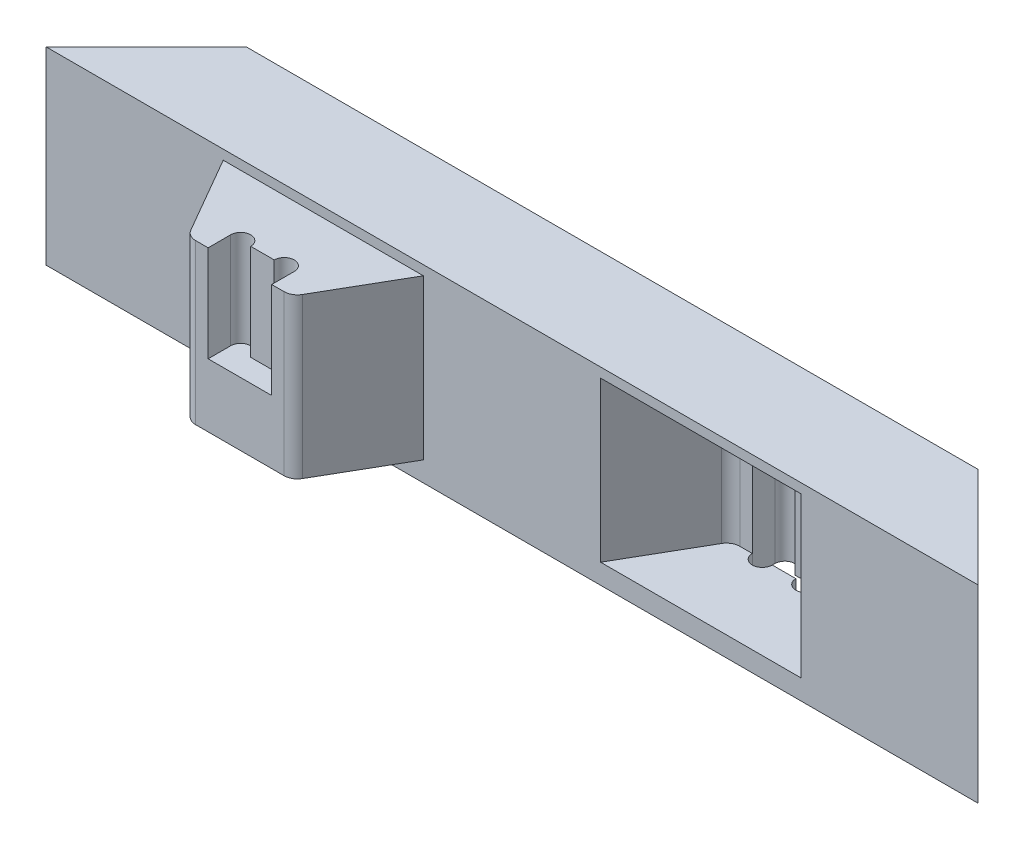
ISO-10303-21;
HEADER;
FILE_DESCRIPTION(('STEP AP214'),'2;1');
FILE_NAME('part.step','',(''),(''),'','','');
FILE_SCHEMA(('AUTOMOTIVE_DESIGN { 1 0 10303 214 1 1 1 1 }'));
ENDSEC;
DATA;
#1=APPLICATION_CONTEXT('core data for automotive mechanical design processes');
#2=APPLICATION_PROTOCOL_DEFINITION('international standard','automotive_design',2000,#1);
#3=PRODUCT_CONTEXT('',#1,'mechanical');
#4=PRODUCT('Part','Part','',(#3));
#5=PRODUCT_RELATED_PRODUCT_CATEGORY('part','',(#4));
#6=PRODUCT_DEFINITION_FORMATION('','',#4);
#7=PRODUCT_DEFINITION_CONTEXT('part definition',#1,'design');
#8=PRODUCT_DEFINITION('design','',#6,#7);
#9=PRODUCT_DEFINITION_SHAPE('','',#8);
#10=(LENGTH_UNIT() NAMED_UNIT(*) SI_UNIT(.MILLI.,.METRE.));
#11=(NAMED_UNIT(*) PLANE_ANGLE_UNIT() SI_UNIT($,.RADIAN.));
#12=(NAMED_UNIT(*) SI_UNIT($,.STERADIAN.) SOLID_ANGLE_UNIT());
#13=UNCERTAINTY_MEASURE_WITH_UNIT(LENGTH_MEASURE(1.E-05),#10,'distance_accuracy_value','');
#14=(GEOMETRIC_REPRESENTATION_CONTEXT(3) GLOBAL_UNCERTAINTY_ASSIGNED_CONTEXT((#13)) GLOBAL_UNIT_ASSIGNED_CONTEXT((#10,
#11,#12)) REPRESENTATION_CONTEXT('',''));
#15=CARTESIAN_POINT('',(0.,0.,0.));
#16=DIRECTION('',(0.,0.,1.));
#17=DIRECTION('',(1.,0.,0.));
#18=AXIS2_PLACEMENT_3D('',#15,#16,#17);
#19=CARTESIAN_POINT('',(-69.85,14.17,10.));
#20=DIRECTION('',(0.,0.,-1.));
#21=DIRECTION('',(-1.,0.,0.));
#22=AXIS2_PLACEMENT_3D('',#19,#20,#21);
#23=PLANE('',#22);
#24=DIRECTION('',(-1.,0.,0.));
#25=VECTOR('',#24,1.);
#26=CARTESIAN_POINT('',(43.2833333333333,12.73,10.));
#27=LINE('',#26,#25);
#28=CARTESIAN_POINT('',(43.2833333333333,12.73,10.));
#29=VERTEX_POINT('',#28);
#30=CARTESIAN_POINT('',(13.2833333333333,12.73,10.));
#31=VERTEX_POINT('',#30);
#32=EDGE_CURVE('E395',#29,#31,#27,.T.);
#33=ORIENTED_EDGE('',*,*,#32,.F.);
#34=DIRECTION('',(0.,-1.,0.));
#35=VECTOR('',#34,1.);
#36=CARTESIAN_POINT('',(43.2833333333333,12.73,10.));
#37=LINE('',#36,#35);
#38=CARTESIAN_POINT('',(43.2833333333333,-11.17,10.));
#39=VERTEX_POINT('',#38);
#40=EDGE_CURVE('E425',#29,#39,#37,.T.);
#41=ORIENTED_EDGE('',*,*,#40,.T.);
#42=DIRECTION('',(-1.,0.,0.));
#43=VECTOR('',#42,1.);
#44=CARTESIAN_POINT('',(43.2833333333333,-11.17,10.));
#45=LINE('',#44,#43);
#46=CARTESIAN_POINT('',(13.2833333333333,-11.17,10.));
#47=VERTEX_POINT('',#46);
#48=EDGE_CURVE('E394',#39,#47,#45,.T.);
#49=ORIENTED_EDGE('',*,*,#48,.T.);
#50=DIRECTION('',(0.,-1.,0.));
#51=VECTOR('',#50,1.);
#52=CARTESIAN_POINT('',(13.2833333333333,12.73,10.));
#53=LINE('',#52,#51);
#54=EDGE_CURVE('E411',#31,#47,#53,.T.);
#55=ORIENTED_EDGE('',*,*,#54,.F.);
#56=EDGE_LOOP('',(#33,#41,#49,#55));
#57=FACE_BOUND('',#56,.T.);
#58=DIRECTION('',(1.,0.,0.));
#59=VECTOR('',#58,1.);
#60=CARTESIAN_POINT('',(-69.85,-14.17,10.));
#61=LINE('',#60,#59);
#62=CARTESIAN_POINT('',(-69.85,-14.17,10.));
#63=VERTEX_POINT('',#62);
#64=CARTESIAN_POINT('',(69.85,-14.17,10.));
#65=VERTEX_POINT('',#64);
#66=EDGE_CURVE('E437',#63,#65,#61,.T.);
#67=ORIENTED_EDGE('',*,*,#66,.T.);
#68=DIRECTION('',(0.,-1.,0.));
#69=VECTOR('',#68,1.);
#70=CARTESIAN_POINT('',(69.85,14.17,10.));
#71=LINE('',#70,#69);
#72=CARTESIAN_POINT('',(69.85,14.17,10.));
#73=VERTEX_POINT('',#72);
#74=EDGE_CURVE('E436',#73,#65,#71,.T.);
#75=ORIENTED_EDGE('',*,*,#74,.F.);
#76=DIRECTION('',(1.,0.,0.));
#77=VECTOR('',#76,1.);
#78=CARTESIAN_POINT('',(-69.85,14.17,10.));
#79=LINE('',#78,#77);
#80=CARTESIAN_POINT('',(-69.85,14.17,10.));
#81=VERTEX_POINT('',#80);
#82=EDGE_CURVE('E433',#81,#73,#79,.T.);
#83=ORIENTED_EDGE('',*,*,#82,.F.);
#84=DIRECTION('',(0.,-1.,0.));
#85=VECTOR('',#84,1.);
#86=CARTESIAN_POINT('',(-69.85,14.17,10.));
#87=LINE('',#86,#85);
#88=EDGE_CURVE('E447',#81,#63,#87,.T.);
#89=ORIENTED_EDGE('',*,*,#88,.T.);
#90=EDGE_LOOP('',(#67,#75,#83,#89));
#91=FACE_BOUND('',#90,.T.);
#92=DIRECTION('',(1.,0.,0.));
#93=VECTOR('',#92,1.);
#94=CARTESIAN_POINT('',(-43.2833333333334,-11.17,10.));
#95=LINE('',#94,#93);
#96=CARTESIAN_POINT('',(-43.2833333333334,-11.17,10.));
#97=VERTEX_POINT('',#96);
#98=CARTESIAN_POINT('',(-13.2833333333334,-11.17,10.));
#99=VERTEX_POINT('',#98);
#100=EDGE_CURVE('E373',#97,#99,#95,.T.);
#101=ORIENTED_EDGE('',*,*,#100,.F.);
#102=DIRECTION('',(0.,-1.,0.));
#103=VECTOR('',#102,1.);
#104=CARTESIAN_POINT('',(-43.2833333333334,45.23,10.));
#105=LINE('',#104,#103);
#106=CARTESIAN_POINT('',(-43.2833333333334,12.73,10.));
#107=VERTEX_POINT('',#106);
#108=EDGE_CURVE('E385',#107,#97,#105,.T.);
#109=ORIENTED_EDGE('',*,*,#108,.F.);
#110=DIRECTION('',(-1.,0.,0.));
#111=VECTOR('',#110,1.);
#112=CARTESIAN_POINT('',(-43.2833333333334,12.73,10.));
#113=LINE('',#112,#111);
#114=CARTESIAN_POINT('',(-13.2833333333334,12.73,10.));
#115=VERTEX_POINT('',#114);
#116=EDGE_CURVE('E370',#115,#107,#113,.T.);
#117=ORIENTED_EDGE('',*,*,#116,.F.);
#118=DIRECTION('',(0.,-1.,0.));
#119=VECTOR('',#118,1.);
#120=CARTESIAN_POINT('',(-13.2833333333334,45.23,10.));
#121=LINE('',#120,#119);
#122=EDGE_CURVE('E363',#115,#99,#121,.T.);
#123=ORIENTED_EDGE('',*,*,#122,.T.);
#124=EDGE_LOOP('',(#101,#109,#117,#123));
#125=FACE_BOUND('',#124,.T.);
#126=ADVANCED_FACE('F38',(#57,#91,#125),#23,.F.);
#127=CARTESIAN_POINT('',(-69.85,14.17,-10.));
#128=DIRECTION('',(0.,0.,1.));
#129=DIRECTION('',(1.,0.,0.));
#130=AXIS2_PLACEMENT_3D('',#127,#128,#129);
#131=PLANE('',#130);
#132=DIRECTION('',(0.,1.,0.));
#133=VECTOR('',#132,1.);
#134=CARTESIAN_POINT('',(-49.8499999999999,14.17,-10.));
#135=LINE('',#134,#133);
#136=CARTESIAN_POINT('',(-49.8499999999999,-14.17,-10.));
#137=VERTEX_POINT('',#136);
#138=CARTESIAN_POINT('',(-49.8499999999999,9.16999999999998,-10.));
#139=VERTEX_POINT('',#138);
#140=EDGE_CURVE('E451',#137,#139,#135,.T.);
#141=ORIENTED_EDGE('',*,*,#140,.T.);
#142=DIRECTION('',(1.,0.,0.));
#143=VECTOR('',#142,1.);
#144=CARTESIAN_POINT('',(-69.85,9.16999999999998,-10.));
#145=LINE('',#144,#143);
#146=CARTESIAN_POINT('',(49.85,9.16999999999998,-10.));
#147=VERTEX_POINT('',#146);
#148=EDGE_CURVE('E478',#139,#147,#145,.T.);
#149=ORIENTED_EDGE('',*,*,#148,.T.);
#150=DIRECTION('',(0.,-1.,0.));
#151=VECTOR('',#150,1.);
#152=CARTESIAN_POINT('',(49.85,14.17,-10.));
#153=LINE('',#152,#151);
#154=CARTESIAN_POINT('',(49.85,-14.17,-10.));
#155=VERTEX_POINT('',#154);
#156=EDGE_CURVE('E455',#147,#155,#153,.T.);
#157=ORIENTED_EDGE('',*,*,#156,.T.);
#158=DIRECTION('',(-1.,0.,0.));
#159=VECTOR('',#158,1.);
#160=CARTESIAN_POINT('',(-69.85,-14.17,-10.));
#161=LINE('',#160,#159);
#162=EDGE_CURVE('E429',#155,#137,#161,.T.);
#163=ORIENTED_EDGE('',*,*,#162,.T.);
#164=EDGE_LOOP('',(#141,#149,#157,#163));
#165=FACE_BOUND('',#164,.T.);
#166=ADVANCED_FACE('F683',(#165),#131,.F.);
#167=CARTESIAN_POINT('',(0.,14.17,0.));
#168=DIRECTION('',(0.,-1.,0.));
#169=DIRECTION('',(0.,0.,-1.));
#170=AXIS2_PLACEMENT_3D('',#167,#168,#169);
#171=PLANE('',#170);
#172=DIRECTION('',(0.707106781186548,0.,0.707106781186547));
#173=VECTOR('',#172,1.);
#174=CARTESIAN_POINT('',(49.85,14.17,-10.));
#175=LINE('',#174,#173);
#176=CARTESIAN_POINT('',(54.85,14.17,-4.99999999999999));
#177=VERTEX_POINT('',#176);
#178=EDGE_CURVE('E467',#73,#177,#175,.F.);
#179=ORIENTED_EDGE('',*,*,#178,.T.);
#180=DIRECTION('',(-1.,0.,0.));
#181=VECTOR('',#180,1.);
#182=CARTESIAN_POINT('',(0.,14.17,-4.99999999999999));
#183=LINE('',#182,#181);
#184=CARTESIAN_POINT('',(-54.85,14.17,-5.));
#185=VERTEX_POINT('',#184);
#186=EDGE_CURVE('E471',#177,#185,#183,.T.);
#187=ORIENTED_EDGE('',*,*,#186,.T.);
#188=DIRECTION('',(0.707106781186549,0.,-0.707106781186546));
#189=VECTOR('',#188,1.);
#190=CARTESIAN_POINT('',(-69.85,14.17,10.));
#191=LINE('',#190,#189);
#192=EDGE_CURVE('E464',#185,#81,#191,.F.);
#193=ORIENTED_EDGE('',*,*,#192,.T.);
#194=ORIENTED_EDGE('',*,*,#82,.T.);
#195=EDGE_LOOP('',(#179,#187,#193,#194));
#196=FACE_BOUND('',#195,.T.);
#197=ADVANCED_FACE('F689',(#196),#171,.F.);
#198=CARTESIAN_POINT('',(0.,-14.17,0.));
#199=DIRECTION('',(0.,-1.,0.));
#200=DIRECTION('',(0.,0.,-1.));
#201=AXIS2_PLACEMENT_3D('',#198,#199,#200);
#202=PLANE('',#201);
#203=CARTESIAN_POINT('',(25.0183333333333,-14.17,-2.5));
#204=DIRECTION('',(0.,-1.,0.));
#205=DIRECTION('',(0.,0.,1.));
#206=AXIS2_PLACEMENT_3D('',#203,#204,#205);
#207=CIRCLE('',#206,1.5);
#208=CARTESIAN_POINT('',(26.5183333333333,-14.17,-2.5));
#209=VERTEX_POINT('',#208);
#210=CARTESIAN_POINT('',(23.5183333333333,-14.17,-2.5));
#211=VERTEX_POINT('',#210);
#212=EDGE_CURVE('E625',#209,#211,#207,.T.);
#213=ORIENTED_EDGE('',*,*,#212,.F.);
#214=DIRECTION('',(-1.,0.,0.));
#215=VECTOR('',#214,1.);
#216=CARTESIAN_POINT('',(26.5183333333333,-14.17,-2.5));
#217=LINE('',#216,#215);
#218=CARTESIAN_POINT('',(30.0483333333333,-14.17,-2.5));
#219=VERTEX_POINT('',#218);
#220=EDGE_CURVE('E277',#219,#209,#217,.T.);
#221=ORIENTED_EDGE('',*,*,#220,.F.);
#222=CARTESIAN_POINT('',(31.5483333333333,-14.17,-2.5));
#223=DIRECTION('',(0.,-1.,0.));
#224=DIRECTION('',(0.,0.,-1.));
#225=AXIS2_PLACEMENT_3D('',#222,#223,#224);
#226=CIRCLE('',#225,1.5);
#227=CARTESIAN_POINT('',(33.0483333333333,-14.17,-2.5));
#228=VERTEX_POINT('',#227);
#229=EDGE_CURVE('E604',#228,#219,#226,.T.);
#230=ORIENTED_EDGE('',*,*,#229,.F.);
#231=DIRECTION('',(0.,0.,1.));
#232=VECTOR('',#231,1.);
#233=CARTESIAN_POINT('',(33.0483333333333,-14.17,-2.5));
#234=LINE('',#233,#232);
#235=CARTESIAN_POINT('',(33.0483333333333,-14.17,-5.88));
#236=VERTEX_POINT('',#235);
#237=EDGE_CURVE('E608',#236,#228,#234,.T.);
#238=ORIENTED_EDGE('',*,*,#237,.F.);
#239=CARTESIAN_POINT('',(31.5483333333333,-14.17,-5.88));
#240=DIRECTION('',(0.,-1.,0.));
#241=DIRECTION('',(0.,0.,1.));
#242=AXIS2_PLACEMENT_3D('',#239,#240,#241);
#243=CIRCLE('',#242,1.5);
#244=CARTESIAN_POINT('',(30.0483333333333,-14.17,-5.88));
#245=VERTEX_POINT('',#244);
#246=EDGE_CURVE('E612',#245,#236,#243,.T.);
#247=ORIENTED_EDGE('',*,*,#246,.F.);
#248=DIRECTION('',(1.,0.,0.));
#249=VECTOR('',#248,1.);
#250=CARTESIAN_POINT('',(26.5183333333333,-14.17,-5.88));
#251=LINE('',#250,#249);
#252=CARTESIAN_POINT('',(26.5183333333333,-14.17,-5.88));
#253=VERTEX_POINT('',#252);
#254=EDGE_CURVE('E616',#253,#245,#251,.T.);
#255=ORIENTED_EDGE('',*,*,#254,.F.);
#256=CARTESIAN_POINT('',(25.0183333333333,-14.17,-5.88));
#257=DIRECTION('',(0.,-1.,0.));
#258=DIRECTION('',(0.,0.,-1.));
#259=AXIS2_PLACEMENT_3D('',#256,#257,#258);
#260=CIRCLE('',#259,1.5);
#261=CARTESIAN_POINT('',(23.5183333333333,-14.17,-5.88));
#262=VERTEX_POINT('',#261);
#263=EDGE_CURVE('E619',#262,#253,#260,.T.);
#264=ORIENTED_EDGE('',*,*,#263,.F.);
#265=DIRECTION('',(0.,0.,-1.));
#266=VECTOR('',#265,1.);
#267=CARTESIAN_POINT('',(23.5183333333333,-14.17,-2.5));
#268=LINE('',#267,#266);
#269=EDGE_CURVE('E622',#211,#262,#268,.T.);
#270=ORIENTED_EDGE('',*,*,#269,.F.);
#271=EDGE_LOOP('',(#213,#221,#230,#238,#247,#255,#264,#270));
#272=FACE_BOUND('',#271,.T.);
#273=ORIENTED_EDGE('',*,*,#162,.F.);
#274=DIRECTION('',(-0.707106781186548,0.,-0.707106781186547));
#275=VECTOR('',#274,1.);
#276=CARTESIAN_POINT('',(29.925,-14.17,-29.925));
#277=LINE('',#276,#275);
#278=EDGE_CURVE('E461',#155,#65,#277,.F.);
#279=ORIENTED_EDGE('',*,*,#278,.T.);
#280=ORIENTED_EDGE('',*,*,#66,.F.);
#281=DIRECTION('',(-0.707106781186549,0.,0.707106781186546));
#282=VECTOR('',#281,1.);
#283=CARTESIAN_POINT('',(-29.9249999999999,-14.17,-29.925));
#284=LINE('',#283,#282);
#285=EDGE_CURVE('E458',#63,#137,#284,.F.);
#286=ORIENTED_EDGE('',*,*,#285,.T.);
#287=EDGE_LOOP('',(#273,#279,#280,#286));
#288=FACE_BOUND('',#287,.T.);
#289=ADVANCED_FACE('F668',(#272,#288),#202,.T.);
#290=CARTESIAN_POINT('',(36.0664549684629,12.73,-2.5));
#291=DIRECTION('',(0.866025403784436,0.,-0.500000000000004));
#292=DIRECTION('',(-0.500000000000004,0.,-0.866025403784436));
#293=AXIS2_PLACEMENT_3D('',#290,#291,#292);
#294=PLANE('',#293);
#295=DIRECTION('',(0.500000000000004,0.,0.866025403784436));
#296=VECTOR('',#295,1.);
#297=CARTESIAN_POINT('',(36.0664549684629,12.73,-2.5));
#298=LINE('',#297,#296);
#299=CARTESIAN_POINT('',(36.6438052376525,12.73,-1.50000000000001));
#300=VERTEX_POINT('',#299);
#301=EDGE_CURVE('E408',#300,#29,#298,.T.);
#302=ORIENTED_EDGE('',*,*,#301,.F.);
#303=DIRECTION('',(0.,-1.,0.));
#304=VECTOR('',#303,1.);
#305=CARTESIAN_POINT('',(36.6438052376525,-11.17,-1.50000000000001));
#306=LINE('',#305,#304);
#307=CARTESIAN_POINT('',(36.6438052376525,-11.17,-1.50000000000001));
#308=VERTEX_POINT('',#307);
#309=EDGE_CURVE('E263',#300,#308,#306,.T.);
#310=ORIENTED_EDGE('',*,*,#309,.T.);
#311=DIRECTION('',(0.500000000000004,0.,0.866025403784436));
#312=VECTOR('',#311,1.);
#313=CARTESIAN_POINT('',(36.0664549684629,-11.17,-2.5));
#314=LINE('',#313,#312);
#315=EDGE_CURVE('E400',#308,#39,#314,.T.);
#316=ORIENTED_EDGE('',*,*,#315,.T.);
#317=ORIENTED_EDGE('',*,*,#40,.F.);
#318=EDGE_LOOP('',(#302,#310,#316,#317));
#319=FACE_BOUND('',#318,.T.);
#320=ADVANCED_FACE('F819',(#319),#294,.F.);
#321=CARTESIAN_POINT('',(20.5002116982037,12.73,-2.5));
#322=DIRECTION('',(0.,0.,-1.));
#323=DIRECTION('',(-1.,0.,0.));
#324=AXIS2_PLACEMENT_3D('',#321,#322,#323);
#325=PLANE('',#324);
#326=DIRECTION('',(1.,0.,0.));
#327=VECTOR('',#326,1.);
#328=CARTESIAN_POINT('',(20.5002116982037,-11.17,-2.5));
#329=LINE('',#328,#327);
#330=CARTESIAN_POINT('',(33.0483333333333,-11.17,-2.5));
#331=VERTEX_POINT('',#330);
#332=CARTESIAN_POINT('',(34.9117544300837,-11.17,-2.5));
#333=VERTEX_POINT('',#332);
#334=EDGE_CURVE('E419',#331,#333,#329,.T.);
#335=ORIENTED_EDGE('',*,*,#334,.T.);
#336=DIRECTION('',(0.,-1.,0.));
#337=VECTOR('',#336,1.);
#338=CARTESIAN_POINT('',(34.9117544300837,12.73,-2.5));
#339=LINE('',#338,#337);
#340=CARTESIAN_POINT('',(34.9117544300837,12.73,-2.5));
#341=VERTEX_POINT('',#340);
#342=EDGE_CURVE('E502',#333,#341,#339,.F.);
#343=ORIENTED_EDGE('',*,*,#342,.T.);
#344=DIRECTION('',(1.,0.,0.));
#345=VECTOR('',#344,1.);
#346=CARTESIAN_POINT('',(20.5002116982037,12.73,-2.5));
#347=LINE('',#346,#345);
#348=CARTESIAN_POINT('',(21.654912236583,12.73,-2.5));
#349=VERTEX_POINT('',#348);
#350=EDGE_CURVE('E404',#349,#341,#347,.T.);
#351=ORIENTED_EDGE('',*,*,#350,.F.);
#352=DIRECTION('',(0.,-1.,0.));
#353=VECTOR('',#352,1.);
#354=CARTESIAN_POINT('',(21.654912236583,-11.17,-2.5));
#355=LINE('',#354,#353);
#356=CARTESIAN_POINT('',(21.654912236583,-11.17,-2.5));
#357=VERTEX_POINT('',#356);
#358=EDGE_CURVE('E499',#349,#357,#355,.T.);
#359=ORIENTED_EDGE('',*,*,#358,.T.);
#360=CARTESIAN_POINT('',(23.5183333333333,-11.17,-2.5));
#361=VERTEX_POINT('',#360);
#362=EDGE_CURVE('E283',#357,#361,#329,.T.);
#363=ORIENTED_EDGE('',*,*,#362,.T.);
#364=DIRECTION('',(0.,-1.,0.));
#365=VECTOR('',#364,1.);
#366=CARTESIAN_POINT('',(23.5183333333333,4.85,-2.5));
#367=LINE('',#366,#365);
#368=CARTESIAN_POINT('',(23.5183333333333,4.85,-2.5));
#369=VERTEX_POINT('',#368);
#370=EDGE_CURVE('E271',#369,#361,#367,.T.);
#371=ORIENTED_EDGE('',*,*,#370,.F.);
#372=DIRECTION('',(1.,0.,0.));
#373=VECTOR('',#372,1.);
#374=CARTESIAN_POINT('',(20.5002116982037,4.85,-2.5));
#375=LINE('',#374,#373);
#376=CARTESIAN_POINT('',(33.0483333333333,4.85,-2.5));
#377=VERTEX_POINT('',#376);
#378=EDGE_CURVE('E251',#369,#377,#375,.T.);
#379=ORIENTED_EDGE('',*,*,#378,.T.);
#380=DIRECTION('',(0.,-1.,0.));
#381=VECTOR('',#380,1.);
#382=CARTESIAN_POINT('',(33.0483333333333,4.85,-2.5));
#383=LINE('',#382,#381);
#384=EDGE_CURVE('E584',#377,#331,#383,.T.);
#385=ORIENTED_EDGE('',*,*,#384,.T.);
#386=EDGE_LOOP('',(#335,#343,#351,#359,#363,#371,#379,#385));
#387=FACE_BOUND('',#386,.T.);
#388=ADVANCED_FACE('F280',(#387),#325,.F.);
#389=CARTESIAN_POINT('',(13.2833333333333,12.73,10.));
#390=DIRECTION('',(-0.866025403784436,0.,-0.500000000000004));
#391=DIRECTION('',(-0.500000000000004,0.,0.866025403784436));
#392=AXIS2_PLACEMENT_3D('',#389,#390,#391);
#393=PLANE('',#392);
#394=DIRECTION('',(0.500000000000004,0.,-0.866025403784436));
#395=VECTOR('',#394,1.);
#396=CARTESIAN_POINT('',(13.2833333333333,-11.17,10.));
#397=LINE('',#396,#395);
#398=CARTESIAN_POINT('',(19.9228614290141,-11.17,-1.50000000000001));
#399=VERTEX_POINT('',#398);
#400=EDGE_CURVE('E415',#47,#399,#397,.T.);
#401=ORIENTED_EDGE('',*,*,#400,.T.);
#402=DIRECTION('',(0.,-1.,0.));
#403=VECTOR('',#402,1.);
#404=CARTESIAN_POINT('',(19.9228614290141,12.73,-1.50000000000001));
#405=LINE('',#404,#403);
#406=CARTESIAN_POINT('',(19.9228614290141,12.73,-1.50000000000001));
#407=VERTEX_POINT('',#406);
#408=EDGE_CURVE('E511',#399,#407,#405,.F.);
#409=ORIENTED_EDGE('',*,*,#408,.T.);
#410=DIRECTION('',(0.500000000000004,0.,-0.866025403784436));
#411=VECTOR('',#410,1.);
#412=CARTESIAN_POINT('',(13.2833333333333,12.73,10.));
#413=LINE('',#412,#411);
#414=EDGE_CURVE('E399',#31,#407,#413,.T.);
#415=ORIENTED_EDGE('',*,*,#414,.F.);
#416=ORIENTED_EDGE('',*,*,#54,.T.);
#417=EDGE_LOOP('',(#401,#409,#415,#416));
#418=FACE_BOUND('',#417,.T.);
#419=ADVANCED_FACE('F800',(#418),#393,.F.);
#420=CARTESIAN_POINT('',(0.,12.73,0.));
#421=DIRECTION('',(0.,-1.,0.));
#422=DIRECTION('',(0.,0.,-1.));
#423=AXIS2_PLACEMENT_3D('',#420,#421,#422);
#424=PLANE('',#423);
#425=ORIENTED_EDGE('',*,*,#350,.T.);
#426=CARTESIAN_POINT('',(34.9117544300837,12.73,-0.499999999999999));
#427=DIRECTION('',(0.,-1.,0.));
#428=DIRECTION('',(0.,0.,-1.));
#429=AXIS2_PLACEMENT_3D('',#426,#427,#428);
#430=CIRCLE('',#429,2.);
#431=EDGE_CURVE('E508',#341,#300,#430,.T.);
#432=ORIENTED_EDGE('',*,*,#431,.T.);
#433=ORIENTED_EDGE('',*,*,#301,.T.);
#434=ORIENTED_EDGE('',*,*,#32,.T.);
#435=ORIENTED_EDGE('',*,*,#414,.T.);
#436=CARTESIAN_POINT('',(21.654912236583,12.73,-0.499999999999999));
#437=DIRECTION('',(0.,-1.,0.));
#438=DIRECTION('',(0.,0.,-1.));
#439=AXIS2_PLACEMENT_3D('',#436,#437,#438);
#440=CIRCLE('',#439,2.);
#441=EDGE_CURVE('E505',#407,#349,#440,.T.);
#442=ORIENTED_EDGE('',*,*,#441,.T.);
#443=EDGE_LOOP('',(#425,#432,#433,#434,#435,#442));
#444=FACE_BOUND('',#443,.T.);
#445=ADVANCED_FACE('F791',(#444),#424,.T.);
#446=CARTESIAN_POINT('',(0.,-11.17,0.));
#447=DIRECTION('',(0.,-1.,0.));
#448=DIRECTION('',(0.,0.,-1.));
#449=AXIS2_PLACEMENT_3D('',#446,#447,#448);
#450=PLANE('',#449);
#451=ORIENTED_EDGE('',*,*,#315,.F.);
#452=CARTESIAN_POINT('',(34.9117544300837,-11.17,-0.499999999999999));
#453=DIRECTION('',(0.,-1.,0.));
#454=DIRECTION('',(0.,0.,-1.));
#455=AXIS2_PLACEMENT_3D('',#452,#453,#454);
#456=CIRCLE('',#455,2.);
#457=EDGE_CURVE('E496',#308,#333,#456,.F.);
#458=ORIENTED_EDGE('',*,*,#457,.T.);
#459=ORIENTED_EDGE('',*,*,#334,.F.);
#460=CARTESIAN_POINT('',(31.5483333333333,-11.17,-2.5));
#461=DIRECTION('',(0.,-1.,0.));
#462=DIRECTION('',(0.,0.,-1.));
#463=AXIS2_PLACEMENT_3D('',#460,#461,#462);
#464=CIRCLE('',#463,1.5);
#465=CARTESIAN_POINT('',(30.0483333333333,-11.17,-2.5));
#466=VERTEX_POINT('',#465);
#467=EDGE_CURVE('E484',#331,#466,#464,.T.);
#468=ORIENTED_EDGE('',*,*,#467,.T.);
#469=CARTESIAN_POINT('',(26.5183333333333,-11.17,-2.5));
#470=VERTEX_POINT('',#469);
#471=EDGE_CURVE('E422',#470,#466,#329,.T.);
#472=ORIENTED_EDGE('',*,*,#471,.F.);
#473=CARTESIAN_POINT('',(25.0183333333333,-11.17,-2.5));
#474=DIRECTION('',(0.,-1.,0.));
#475=DIRECTION('',(0.,0.,-1.));
#476=AXIS2_PLACEMENT_3D('',#473,#474,#475);
#477=CIRCLE('',#476,1.5);
#478=EDGE_CURVE('E264',#470,#361,#477,.T.);
#479=ORIENTED_EDGE('',*,*,#478,.T.);
#480=ORIENTED_EDGE('',*,*,#362,.F.);
#481=CARTESIAN_POINT('',(21.654912236583,-11.17,-0.499999999999999));
#482=DIRECTION('',(0.,-1.,0.));
#483=DIRECTION('',(0.,0.,-1.));
#484=AXIS2_PLACEMENT_3D('',#481,#482,#483);
#485=CIRCLE('',#484,2.);
#486=EDGE_CURVE('E493',#357,#399,#485,.F.);
#487=ORIENTED_EDGE('',*,*,#486,.T.);
#488=ORIENTED_EDGE('',*,*,#400,.F.);
#489=ORIENTED_EDGE('',*,*,#48,.F.);
#490=EDGE_LOOP('',(#451,#458,#459,#468,#472,#479,#480,#487,#488,#489));
#491=FACE_BOUND('',#490,.T.);
#492=ADVANCED_FACE('F655',(#491),#450,.F.);
#493=CARTESIAN_POINT('',(-43.2833333333334,45.23,10.));
#494=DIRECTION('',(-0.866025403784436,0.,0.500000000000005));
#495=DIRECTION('',(0.500000000000005,0.,0.866025403784436));
#496=AXIS2_PLACEMENT_3D('',#493,#494,#495);
#497=PLANE('',#496);
#498=DIRECTION('',(-0.500000000000005,0.,-0.866025403784436));
#499=VECTOR('',#498,1.);
#500=CARTESIAN_POINT('',(-43.2833333333334,-11.17,10.));
#501=LINE('',#500,#499);
#502=CARTESIAN_POINT('',(-36.6438052376526,-11.17,21.5));
#503=VERTEX_POINT('',#502);
#504=EDGE_CURVE('E342',#503,#97,#501,.T.);
#505=ORIENTED_EDGE('',*,*,#504,.F.);
#506=DIRECTION('',(0.,-1.,0.));
#507=VECTOR('',#506,1.);
#508=CARTESIAN_POINT('',(-36.6438052376526,45.23,21.5));
#509=LINE('',#508,#507);
#510=CARTESIAN_POINT('',(-36.6438052376526,12.73,21.5));
#511=VERTEX_POINT('',#510);
#512=EDGE_CURVE('E11',#503,#511,#509,.F.);
#513=ORIENTED_EDGE('',*,*,#512,.T.);
#514=DIRECTION('',(0.500000000000005,0.,0.866025403784436));
#515=VECTOR('',#514,1.);
#516=CARTESIAN_POINT('',(-43.2833333333334,12.73,10.));
#517=LINE('',#516,#515);
#518=EDGE_CURVE('E367',#107,#511,#517,.T.);
#519=ORIENTED_EDGE('',*,*,#518,.F.);
#520=ORIENTED_EDGE('',*,*,#108,.T.);
#521=EDGE_LOOP('',(#505,#513,#519,#520));
#522=FACE_BOUND('',#521,.T.);
#523=ADVANCED_FACE('F554',(#522),#497,.T.);
#524=CARTESIAN_POINT('',(-36.066454968463,45.23,22.5));
#525=DIRECTION('',(0.,0.,1.));
#526=DIRECTION('',(1.,0.,0.));
#527=AXIS2_PLACEMENT_3D('',#524,#525,#526);
#528=PLANE('',#527);
#529=DIRECTION('',(-1.,0.,0.));
#530=VECTOR('',#529,1.);
#531=CARTESIAN_POINT('',(-36.066454968463,-11.17,22.5));
#532=LINE('',#531,#530);
#533=CARTESIAN_POINT('',(-21.654912236583,-11.17,22.5));
#534=VERTEX_POINT('',#533);
#535=CARTESIAN_POINT('',(-34.9117544300837,-11.17,22.5));
#536=VERTEX_POINT('',#535);
#537=EDGE_CURVE('E381',#534,#536,#532,.T.);
#538=ORIENTED_EDGE('',*,*,#537,.F.);
#539=DIRECTION('',(0.,-1.,0.));
#540=VECTOR('',#539,1.);
#541=CARTESIAN_POINT('',(-21.654912236583,45.23,22.5));
#542=LINE('',#541,#540);
#543=CARTESIAN_POINT('',(-21.654912236583,12.73,22.5));
#544=VERTEX_POINT('',#543);
#545=EDGE_CURVE('E60',#534,#544,#542,.F.);
#546=ORIENTED_EDGE('',*,*,#545,.T.);
#547=DIRECTION('',(1.,0.,0.));
#548=VECTOR('',#547,1.);
#549=CARTESIAN_POINT('',(-36.066454968463,12.73,22.5));
#550=LINE('',#549,#548);
#551=CARTESIAN_POINT('',(-23.5183333333334,12.73,22.5));
#552=VERTEX_POINT('',#551);
#553=EDGE_CURVE('E362',#552,#544,#550,.T.);
#554=ORIENTED_EDGE('',*,*,#553,.F.);
#555=DIRECTION('',(0.,1.,0.));
#556=VECTOR('',#555,1.);
#557=CARTESIAN_POINT('',(-23.5183333333334,-1.68,22.5));
#558=LINE('',#557,#556);
#559=CARTESIAN_POINT('',(-23.5183333333334,-1.68,22.5));
#560=VERTEX_POINT('',#559);
#561=EDGE_CURVE('E349',#560,#552,#558,.T.);
#562=ORIENTED_EDGE('',*,*,#561,.F.);
#563=DIRECTION('',(1.,0.,0.));
#564=VECTOR('',#563,1.);
#565=CARTESIAN_POINT('',(-33.0483333333334,-1.68,22.5));
#566=LINE('',#565,#564);
#567=CARTESIAN_POINT('',(-33.0483333333334,-1.68,22.5));
#568=VERTEX_POINT('',#567);
#569=EDGE_CURVE('E303',#568,#560,#566,.T.);
#570=ORIENTED_EDGE('',*,*,#569,.F.);
#571=DIRECTION('',(0.,1.,0.));
#572=VECTOR('',#571,1.);
#573=CARTESIAN_POINT('',(-33.0483333333334,-1.68,22.5));
#574=LINE('',#573,#572);
#575=CARTESIAN_POINT('',(-33.0483333333334,12.73,22.5));
#576=VERTEX_POINT('',#575);
#577=EDGE_CURVE('E352',#568,#576,#574,.T.);
#578=ORIENTED_EDGE('',*,*,#577,.T.);
#579=CARTESIAN_POINT('',(-34.9117544300837,12.73,22.5));
#580=VERTEX_POINT('',#579);
#581=EDGE_CURVE('E364',#580,#576,#550,.T.);
#582=ORIENTED_EDGE('',*,*,#581,.F.);
#583=DIRECTION('',(0.,-1.,0.));
#584=VECTOR('',#583,1.);
#585=CARTESIAN_POINT('',(-34.9117544300837,45.23,22.5));
#586=LINE('',#585,#584);
#587=EDGE_CURVE('E524',#580,#536,#586,.T.);
#588=ORIENTED_EDGE('',*,*,#587,.T.);
#589=EDGE_LOOP('',(#538,#546,#554,#562,#570,#578,#582,#588));
#590=FACE_BOUND('',#589,.T.);
#591=ADVANCED_FACE('F548',(#590),#528,.T.);
#592=CARTESIAN_POINT('',(-20.5002116982038,45.23,22.5));
#593=DIRECTION('',(0.866025403784436,0.,0.500000000000004));
#594=DIRECTION('',(0.500000000000004,0.,-0.866025403784436));
#595=AXIS2_PLACEMENT_3D('',#592,#593,#594);
#596=PLANE('',#595);
#597=DIRECTION('',(0.500000000000004,0.,-0.866025403784436));
#598=VECTOR('',#597,1.);
#599=CARTESIAN_POINT('',(-20.5002116982038,12.73,22.5));
#600=LINE('',#599,#598);
#601=CARTESIAN_POINT('',(-19.9228614290141,12.73,21.5));
#602=VERTEX_POINT('',#601);
#603=EDGE_CURVE('E359',#602,#115,#600,.T.);
#604=ORIENTED_EDGE('',*,*,#603,.F.);
#605=DIRECTION('',(0.,-1.,0.));
#606=VECTOR('',#605,1.);
#607=CARTESIAN_POINT('',(-19.9228614290141,45.23,21.5));
#608=LINE('',#607,#606);
#609=CARTESIAN_POINT('',(-19.9228614290141,-11.17,21.5));
#610=VERTEX_POINT('',#609);
#611=EDGE_CURVE('E514',#602,#610,#608,.T.);
#612=ORIENTED_EDGE('',*,*,#611,.T.);
#613=DIRECTION('',(-0.500000000000004,0.,0.866025403784436));
#614=VECTOR('',#613,1.);
#615=CARTESIAN_POINT('',(-20.5002116982038,-11.17,22.5));
#616=LINE('',#615,#614);
#617=EDGE_CURVE('E377',#99,#610,#616,.T.);
#618=ORIENTED_EDGE('',*,*,#617,.F.);
#619=ORIENTED_EDGE('',*,*,#122,.F.);
#620=EDGE_LOOP('',(#604,#612,#618,#619));
#621=FACE_BOUND('',#620,.T.);
#622=ADVANCED_FACE('F543',(#621),#596,.T.);
#623=CARTESIAN_POINT('',(0.,-11.17,0.));
#624=DIRECTION('',(0.,1.,0.));
#625=DIRECTION('',(0.,0.,1.));
#626=AXIS2_PLACEMENT_3D('',#623,#624,#625);
#627=PLANE('',#626);
#628=ORIENTED_EDGE('',*,*,#617,.T.);
#629=CARTESIAN_POINT('',(-21.654912236583,-11.17,20.5));
#630=DIRECTION('',(0.,1.,0.));
#631=DIRECTION('',(0.,0.,1.));
#632=AXIS2_PLACEMENT_3D('',#629,#630,#631);
#633=CIRCLE('',#632,2.);
#634=EDGE_CURVE('E521',#610,#534,#633,.F.);
#635=ORIENTED_EDGE('',*,*,#634,.T.);
#636=ORIENTED_EDGE('',*,*,#537,.T.);
#637=CARTESIAN_POINT('',(-34.9117544300837,-11.17,20.5));
#638=DIRECTION('',(0.,1.,0.));
#639=DIRECTION('',(0.,0.,1.));
#640=AXIS2_PLACEMENT_3D('',#637,#638,#639);
#641=CIRCLE('',#640,2.);
#642=EDGE_CURVE('E518',#536,#503,#641,.F.);
#643=ORIENTED_EDGE('',*,*,#642,.T.);
#644=ORIENTED_EDGE('',*,*,#504,.T.);
#645=ORIENTED_EDGE('',*,*,#100,.T.);
#646=EDGE_LOOP('',(#628,#635,#636,#643,#644,#645));
#647=FACE_BOUND('',#646,.T.);
#648=ADVANCED_FACE('F547',(#647),#627,.F.);
#649=CARTESIAN_POINT('',(0.,12.73,0.));
#650=DIRECTION('',(0.,-1.,0.));
#651=DIRECTION('',(0.,0.,-1.));
#652=AXIS2_PLACEMENT_3D('',#649,#650,#651);
#653=PLANE('',#652);
#654=ORIENTED_EDGE('',*,*,#553,.T.);
#655=CARTESIAN_POINT('',(-21.654912236583,12.73,20.5));
#656=DIRECTION('',(0.,-1.,0.));
#657=DIRECTION('',(0.,0.,-1.));
#658=AXIS2_PLACEMENT_3D('',#655,#656,#657);
#659=CIRCLE('',#658,2.);
#660=EDGE_CURVE('E47',#544,#602,#659,.F.);
#661=ORIENTED_EDGE('',*,*,#660,.T.);
#662=ORIENTED_EDGE('',*,*,#603,.T.);
#663=ORIENTED_EDGE('',*,*,#116,.T.);
#664=ORIENTED_EDGE('',*,*,#518,.T.);
#665=CARTESIAN_POINT('',(-34.9117544300837,12.73,20.5));
#666=DIRECTION('',(0.,-1.,0.));
#667=DIRECTION('',(0.,0.,-1.));
#668=AXIS2_PLACEMENT_3D('',#665,#666,#667);
#669=CIRCLE('',#668,2.);
#670=EDGE_CURVE('E530',#511,#580,#669,.F.);
#671=ORIENTED_EDGE('',*,*,#670,.T.);
#672=ORIENTED_EDGE('',*,*,#581,.T.);
#673=DIRECTION('',(0.,0.,1.));
#674=VECTOR('',#673,1.);
#675=CARTESIAN_POINT('',(-33.0483333333334,12.73,19.12));
#676=LINE('',#675,#674);
#677=CARTESIAN_POINT('',(-33.0483333333334,12.73,19.12));
#678=VERTEX_POINT('',#677);
#679=EDGE_CURVE('E323',#678,#576,#676,.T.);
#680=ORIENTED_EDGE('',*,*,#679,.F.);
#681=CARTESIAN_POINT('',(-31.5483333333334,12.73,19.12));
#682=DIRECTION('',(0.,1.,0.));
#683=DIRECTION('',(0.,0.,-1.));
#684=AXIS2_PLACEMENT_3D('',#681,#682,#683);
#685=CIRCLE('',#684,1.5);
#686=CARTESIAN_POINT('',(-30.0483333333334,12.73,19.12));
#687=VERTEX_POINT('',#686);
#688=EDGE_CURVE('E320',#687,#678,#685,.T.);
#689=ORIENTED_EDGE('',*,*,#688,.F.);
#690=DIRECTION('',(-1.,0.,0.));
#691=VECTOR('',#690,1.);
#692=CARTESIAN_POINT('',(-30.0483333333334,12.73,19.12));
#693=LINE('',#692,#691);
#694=CARTESIAN_POINT('',(-26.5183333333334,12.73,19.12));
#695=VERTEX_POINT('',#694);
#696=EDGE_CURVE('E299',#695,#687,#693,.T.);
#697=ORIENTED_EDGE('',*,*,#696,.F.);
#698=CARTESIAN_POINT('',(-25.0183333333334,12.73,19.12));
#699=DIRECTION('',(0.,1.,0.));
#700=DIRECTION('',(0.,0.,1.));
#701=AXIS2_PLACEMENT_3D('',#698,#699,#700);
#702=CIRCLE('',#701,1.5);
#703=CARTESIAN_POINT('',(-23.5183333333334,12.73,19.12));
#704=VERTEX_POINT('',#703);
#705=EDGE_CURVE('E332',#704,#695,#702,.T.);
#706=ORIENTED_EDGE('',*,*,#705,.F.);
#707=DIRECTION('',(0.,0.,-1.));
#708=VECTOR('',#707,1.);
#709=CARTESIAN_POINT('',(-23.5183333333334,12.73,22.5));
#710=LINE('',#709,#708);
#711=EDGE_CURVE('E328',#552,#704,#710,.T.);
#712=ORIENTED_EDGE('',*,*,#711,.F.);
#713=EDGE_LOOP('',(#654,#661,#662,#663,#664,#671,#672,#680,#689,#697,#706,#712));
#714=FACE_BOUND('',#713,.T.);
#715=ADVANCED_FACE('F536',(#714),#653,.F.);
#716=CARTESIAN_POINT('',(49.85,14.17,-10.));
#717=DIRECTION('',(-0.707106781186547,0.,0.707106781186548));
#718=DIRECTION('',(0.,-1.,0.));
#719=AXIS2_PLACEMENT_3D('',#716,#717,#718);
#720=PLANE('',#719);
#721=ORIENTED_EDGE('',*,*,#156,.F.);
#722=DIRECTION('',(0.577350269189625,0.577350269189627,0.577350269189625));
#723=VECTOR('',#722,1.);
#724=CARTESIAN_POINT('',(51.5166666666666,10.8366666666667,-8.33333333333333));
#725=LINE('',#724,#723);
#726=EDGE_CURVE('E481',#147,#177,#725,.T.);
#727=ORIENTED_EDGE('',*,*,#726,.T.);
#728=ORIENTED_EDGE('',*,*,#178,.F.);
#729=ORIENTED_EDGE('',*,*,#74,.T.);
#730=ORIENTED_EDGE('',*,*,#278,.F.);
#731=EDGE_LOOP('',(#721,#727,#728,#729,#730));
#732=FACE_BOUND('',#731,.T.);
#733=ADVANCED_FACE('F697',(#732),#720,.F.);
#734=CARTESIAN_POINT('',(-69.85,14.17,10.));
#735=DIRECTION('',(0.707106781186546,0.,0.707106781186549));
#736=DIRECTION('',(0.,-1.,0.));
#737=AXIS2_PLACEMENT_3D('',#734,#735,#736);
#738=PLANE('',#737);
#739=ORIENTED_EDGE('',*,*,#192,.F.);
#740=DIRECTION('',(0.577350269189627,-0.577350269189626,-0.577350269189625));
#741=VECTOR('',#740,1.);
#742=CARTESIAN_POINT('',(-64.85,24.17,5.));
#743=LINE('',#742,#741);
#744=EDGE_CURVE('E475',#185,#139,#743,.T.);
#745=ORIENTED_EDGE('',*,*,#744,.T.);
#746=ORIENTED_EDGE('',*,*,#140,.F.);
#747=ORIENTED_EDGE('',*,*,#285,.F.);
#748=ORIENTED_EDGE('',*,*,#88,.F.);
#749=EDGE_LOOP('',(#739,#745,#746,#747,#748));
#750=FACE_BOUND('',#749,.T.);
#751=ADVANCED_FACE('F700',(#750),#738,.F.);
#752=CARTESIAN_POINT('',(0.,14.17,-4.99999999999999));
#753=DIRECTION('',(0.,-0.707106781186547,0.707106781186549));
#754=DIRECTION('',(-1.,0.,0.));
#755=AXIS2_PLACEMENT_3D('',#752,#753,#754);
#756=PLANE('',#755);
#757=ORIENTED_EDGE('',*,*,#726,.F.);
#758=ORIENTED_EDGE('',*,*,#148,.F.);
#759=ORIENTED_EDGE('',*,*,#744,.F.);
#760=ORIENTED_EDGE('',*,*,#186,.F.);
#761=EDGE_LOOP('',(#757,#758,#759,#760));
#762=FACE_BOUND('',#761,.T.);
#763=ADVANCED_FACE('F704',(#762),#756,.F.);
#764=CARTESIAN_POINT('',(-31.5483333333334,-1.68,19.12));
#765=DIRECTION('',(0.,1.,0.));
#766=DIRECTION('',(0.,0.,1.));
#767=AXIS2_PLACEMENT_3D('',#764,#765,#766);
#768=CYLINDRICAL_SURFACE('',#767,1.5);
#769=ORIENTED_EDGE('',*,*,#688,.T.);
#770=DIRECTION('',(0.,1.,0.));
#771=VECTOR('',#770,1.);
#772=CARTESIAN_POINT('',(-33.0483333333334,-1.68,19.12));
#773=LINE('',#772,#771);
#774=CARTESIAN_POINT('',(-33.0483333333334,-1.68,19.12));
#775=VERTEX_POINT('',#774);
#776=EDGE_CURVE('E319',#775,#678,#773,.T.);
#777=ORIENTED_EDGE('',*,*,#776,.F.);
#778=CARTESIAN_POINT('',(-31.5483333333334,-1.68,19.12));
#779=DIRECTION('',(0.,1.,0.));
#780=DIRECTION('',(0.,0.,-1.));
#781=AXIS2_PLACEMENT_3D('',#778,#779,#780);
#782=CIRCLE('',#781,1.5);
#783=CARTESIAN_POINT('',(-30.0483333333334,-1.68,19.12));
#784=VERTEX_POINT('',#783);
#785=EDGE_CURVE('E294',#784,#775,#782,.T.);
#786=ORIENTED_EDGE('',*,*,#785,.F.);
#787=DIRECTION('',(0.,1.,0.));
#788=VECTOR('',#787,1.);
#789=CARTESIAN_POINT('',(-30.0483333333334,-1.68,19.12));
#790=LINE('',#789,#788);
#791=EDGE_CURVE('E339',#784,#687,#790,.T.);
#792=ORIENTED_EDGE('',*,*,#791,.T.);
#793=EDGE_LOOP('',(#769,#777,#786,#792));
#794=FACE_BOUND('',#793,.T.);
#795=ADVANCED_FACE('F568',(#794),#768,.F.);
#796=CARTESIAN_POINT('',(-30.0483333333334,-1.68,19.12));
#797=DIRECTION('',(0.,0.,-1.));
#798=DIRECTION('',(-1.,0.,0.));
#799=AXIS2_PLACEMENT_3D('',#796,#797,#798);
#800=PLANE('',#799);
#801=ORIENTED_EDGE('',*,*,#696,.T.);
#802=ORIENTED_EDGE('',*,*,#791,.F.);
#803=DIRECTION('',(-1.,0.,0.));
#804=VECTOR('',#803,1.);
#805=CARTESIAN_POINT('',(-30.0483333333334,-1.68,19.12));
#806=LINE('',#805,#804);
#807=CARTESIAN_POINT('',(-26.5183333333334,-1.68,19.12));
#808=VERTEX_POINT('',#807);
#809=EDGE_CURVE('E315',#808,#784,#806,.T.);
#810=ORIENTED_EDGE('',*,*,#809,.F.);
#811=DIRECTION('',(0.,1.,0.));
#812=VECTOR('',#811,1.);
#813=CARTESIAN_POINT('',(-26.5183333333334,-1.68,19.12));
#814=LINE('',#813,#812);
#815=EDGE_CURVE('E343',#808,#695,#814,.T.);
#816=ORIENTED_EDGE('',*,*,#815,.T.);
#817=EDGE_LOOP('',(#801,#802,#810,#816));
#818=FACE_BOUND('',#817,.T.);
#819=ADVANCED_FACE('F572',(#818),#800,.F.);
#820=CARTESIAN_POINT('',(-25.0183333333334,-1.68,19.12));
#821=DIRECTION('',(0.,1.,0.));
#822=DIRECTION('',(0.,0.,1.));
#823=AXIS2_PLACEMENT_3D('',#820,#821,#822);
#824=CYLINDRICAL_SURFACE('',#823,1.5);
#825=ORIENTED_EDGE('',*,*,#705,.T.);
#826=ORIENTED_EDGE('',*,*,#815,.F.);
#827=CARTESIAN_POINT('',(-25.0183333333334,-1.68,19.12));
#828=DIRECTION('',(0.,1.,0.));
#829=DIRECTION('',(0.,0.,1.));
#830=AXIS2_PLACEMENT_3D('',#827,#828,#829);
#831=CIRCLE('',#830,1.5);
#832=CARTESIAN_POINT('',(-23.5183333333334,-1.68,19.12));
#833=VERTEX_POINT('',#832);
#834=EDGE_CURVE('E311',#833,#808,#831,.T.);
#835=ORIENTED_EDGE('',*,*,#834,.F.);
#836=DIRECTION('',(0.,1.,0.));
#837=VECTOR('',#836,1.);
#838=CARTESIAN_POINT('',(-23.5183333333334,-1.68,19.12));
#839=LINE('',#838,#837);
#840=EDGE_CURVE('E346',#833,#704,#839,.T.);
#841=ORIENTED_EDGE('',*,*,#840,.T.);
#842=EDGE_LOOP('',(#825,#826,#835,#841));
#843=FACE_BOUND('',#842,.T.);
#844=ADVANCED_FACE('F575',(#843),#824,.F.);
#845=CARTESIAN_POINT('',(-23.5183333333334,-1.68,22.5));
#846=DIRECTION('',(1.,0.,0.));
#847=DIRECTION('',(0.,0.,-1.));
#848=AXIS2_PLACEMENT_3D('',#845,#846,#847);
#849=PLANE('',#848);
#850=ORIENTED_EDGE('',*,*,#711,.T.);
#851=ORIENTED_EDGE('',*,*,#840,.F.);
#852=DIRECTION('',(0.,0.,-1.));
#853=VECTOR('',#852,1.);
#854=CARTESIAN_POINT('',(-23.5183333333334,-1.68,22.5));
#855=LINE('',#854,#853);
#856=EDGE_CURVE('E307',#560,#833,#855,.T.);
#857=ORIENTED_EDGE('',*,*,#856,.F.);
#858=ORIENTED_EDGE('',*,*,#561,.T.);
#859=EDGE_LOOP('',(#850,#851,#857,#858));
#860=FACE_BOUND('',#859,.T.);
#861=ADVANCED_FACE('F577',(#860),#849,.F.);
#862=CARTESIAN_POINT('',(-33.0483333333334,-1.68,19.12));
#863=DIRECTION('',(-1.,0.,0.));
#864=DIRECTION('',(0.,0.,1.));
#865=AXIS2_PLACEMENT_3D('',#862,#863,#864);
#866=PLANE('',#865);
#867=ORIENTED_EDGE('',*,*,#679,.T.);
#868=ORIENTED_EDGE('',*,*,#577,.F.);
#869=DIRECTION('',(0.,0.,1.));
#870=VECTOR('',#869,1.);
#871=CARTESIAN_POINT('',(-33.0483333333334,-1.68,19.12));
#872=LINE('',#871,#870);
#873=EDGE_CURVE('E298',#775,#568,#872,.T.);
#874=ORIENTED_EDGE('',*,*,#873,.F.);
#875=ORIENTED_EDGE('',*,*,#776,.T.);
#876=EDGE_LOOP('',(#867,#868,#874,#875));
#877=FACE_BOUND('',#876,.T.);
#878=ADVANCED_FACE('F559',(#877),#866,.F.);
#879=CARTESIAN_POINT('',(-31.5483333333334,-1.68,19.12));
#880=DIRECTION('',(0.,-1.,0.));
#881=DIRECTION('',(0.,0.,-1.));
#882=AXIS2_PLACEMENT_3D('',#879,#880,#881);
#883=PLANE('',#882);
#884=ORIENTED_EDGE('',*,*,#785,.T.);
#885=ORIENTED_EDGE('',*,*,#873,.T.);
#886=ORIENTED_EDGE('',*,*,#569,.T.);
#887=ORIENTED_EDGE('',*,*,#856,.T.);
#888=ORIENTED_EDGE('',*,*,#834,.T.);
#889=ORIENTED_EDGE('',*,*,#809,.T.);
#890=EDGE_LOOP('',(#884,#885,#886,#887,#888,#889));
#891=FACE_BOUND('',#890,.T.);
#892=ADVANCED_FACE('F564',(#891),#883,.F.);
#893=CARTESIAN_POINT('',(25.0183333333333,4.85,-2.5));
#894=DIRECTION('',(0.,1.,0.));
#895=DIRECTION('',(0.,0.,1.));
#896=AXIS2_PLACEMENT_3D('',#893,#894,#895);
#897=PLANE('',#896);
#898=DIRECTION('',(0.,0.,-1.));
#899=VECTOR('',#898,1.);
#900=CARTESIAN_POINT('',(23.5183333333333,4.85,-2.5));
#901=LINE('',#900,#899);
#902=CARTESIAN_POINT('',(23.5183333333333,4.85,-5.88));
#903=VERTEX_POINT('',#902);
#904=EDGE_CURVE('E255',#369,#903,#901,.T.);
#905=ORIENTED_EDGE('',*,*,#904,.T.);
#906=CARTESIAN_POINT('',(25.0183333333333,4.85,-5.88));
#907=DIRECTION('',(0.,-1.,0.));
#908=DIRECTION('',(0.,0.,-1.));
#909=AXIS2_PLACEMENT_3D('',#906,#907,#908);
#910=CIRCLE('',#909,1.5);
#911=CARTESIAN_POINT('',(26.5183333333333,4.85,-5.88));
#912=VERTEX_POINT('',#911);
#913=EDGE_CURVE('E276',#903,#912,#910,.T.);
#914=ORIENTED_EDGE('',*,*,#913,.T.);
#915=DIRECTION('',(1.,0.,0.));
#916=VECTOR('',#915,1.);
#917=CARTESIAN_POINT('',(26.5183333333333,4.85,-5.88));
#918=LINE('',#917,#916);
#919=CARTESIAN_POINT('',(30.0483333333333,4.85,-5.88));
#920=VERTEX_POINT('',#919);
#921=EDGE_CURVE('E633',#912,#920,#918,.T.);
#922=ORIENTED_EDGE('',*,*,#921,.T.);
#923=CARTESIAN_POINT('',(31.5483333333333,4.85,-5.88));
#924=DIRECTION('',(0.,-1.,0.));
#925=DIRECTION('',(0.,0.,1.));
#926=AXIS2_PLACEMENT_3D('',#923,#924,#925);
#927=CIRCLE('',#926,1.5);
#928=CARTESIAN_POINT('',(33.0483333333333,4.85,-5.88));
#929=VERTEX_POINT('',#928);
#930=EDGE_CURVE('E630',#920,#929,#927,.T.);
#931=ORIENTED_EDGE('',*,*,#930,.T.);
#932=DIRECTION('',(0.,0.,1.));
#933=VECTOR('',#932,1.);
#934=CARTESIAN_POINT('',(33.0483333333333,4.85,-2.5));
#935=LINE('',#934,#933);
#936=EDGE_CURVE('E258',#929,#377,#935,.T.);
#937=ORIENTED_EDGE('',*,*,#936,.T.);
#938=ORIENTED_EDGE('',*,*,#378,.F.);
#939=EDGE_LOOP('',(#905,#914,#922,#931,#937,#938));
#940=FACE_BOUND('',#939,.T.);
#941=ADVANCED_FACE('F253',(#940),#897,.F.);
#942=CARTESIAN_POINT('',(25.0183333333333,4.85,-2.5));
#943=DIRECTION('',(0.,-1.,0.));
#944=DIRECTION('',(0.,0.,-1.));
#945=AXIS2_PLACEMENT_3D('',#942,#943,#944);
#946=CYLINDRICAL_SURFACE('',#945,1.5);
#947=DIRECTION('',(0.,-1.,0.));
#948=VECTOR('',#947,1.);
#949=CARTESIAN_POINT('',(26.5183333333333,4.85,-2.5));
#950=LINE('',#949,#948);
#951=EDGE_CURVE('E324',#470,#209,#950,.T.);
#952=ORIENTED_EDGE('',*,*,#951,.T.);
#953=ORIENTED_EDGE('',*,*,#212,.T.);
#954=EDGE_CURVE('E286',#361,#211,#367,.T.);
#955=ORIENTED_EDGE('',*,*,#954,.F.);
#956=ORIENTED_EDGE('',*,*,#478,.F.);
#957=EDGE_LOOP('',(#952,#953,#955,#956));
#958=FACE_BOUND('',#957,.T.);
#959=ADVANCED_FACE('F664',(#958),#946,.F.);
#960=CARTESIAN_POINT('',(26.5183333333333,4.85,-2.5));
#961=DIRECTION('',(0.,0.,1.));
#962=DIRECTION('',(1.,0.,0.));
#963=AXIS2_PLACEMENT_3D('',#960,#961,#962);
#964=PLANE('',#963);
#965=DIRECTION('',(0.,-1.,0.));
#966=VECTOR('',#965,1.);
#967=CARTESIAN_POINT('',(30.0483333333333,4.85,-2.5));
#968=LINE('',#967,#966);
#969=EDGE_CURVE('E581',#466,#219,#968,.T.);
#970=ORIENTED_EDGE('',*,*,#969,.T.);
#971=ORIENTED_EDGE('',*,*,#220,.T.);
#972=ORIENTED_EDGE('',*,*,#951,.F.);
#973=ORIENTED_EDGE('',*,*,#471,.T.);
#974=EDGE_LOOP('',(#970,#971,#972,#973));
#975=FACE_BOUND('',#974,.T.);
#976=ADVANCED_FACE('F662',(#975),#964,.F.);
#977=CARTESIAN_POINT('',(31.5483333333333,4.85,-2.5));
#978=DIRECTION('',(0.,-1.,0.));
#979=DIRECTION('',(0.,0.,-1.));
#980=AXIS2_PLACEMENT_3D('',#977,#978,#979);
#981=CYLINDRICAL_SURFACE('',#980,1.5);
#982=EDGE_CURVE('E587',#331,#228,#383,.T.);
#983=ORIENTED_EDGE('',*,*,#982,.T.);
#984=ORIENTED_EDGE('',*,*,#229,.T.);
#985=ORIENTED_EDGE('',*,*,#969,.F.);
#986=ORIENTED_EDGE('',*,*,#467,.F.);
#987=EDGE_LOOP('',(#983,#984,#985,#986));
#988=FACE_BOUND('',#987,.T.);
#989=ADVANCED_FACE('F673',(#988),#981,.F.);
#990=CARTESIAN_POINT('',(33.0483333333333,4.85,-2.5));
#991=DIRECTION('',(1.,0.,0.));
#992=DIRECTION('',(0.,0.,-1.));
#993=AXIS2_PLACEMENT_3D('',#990,#991,#992);
#994=PLANE('',#993);
#995=ORIENTED_EDGE('',*,*,#237,.T.);
#996=ORIENTED_EDGE('',*,*,#982,.F.);
#997=ORIENTED_EDGE('',*,*,#384,.F.);
#998=ORIENTED_EDGE('',*,*,#936,.F.);
#999=DIRECTION('',(0.,-1.,0.));
#1000=VECTOR('',#999,1.);
#1001=CARTESIAN_POINT('',(33.0483333333333,4.85,-5.88));
#1002=LINE('',#1001,#1000);
#1003=EDGE_CURVE('E590',#929,#236,#1002,.T.);
#1004=ORIENTED_EDGE('',*,*,#1003,.T.);
#1005=EDGE_LOOP('',(#995,#996,#997,#998,#1004));
#1006=FACE_BOUND('',#1005,.T.);
#1007=ADVANCED_FACE('F649',(#1006),#994,.F.);
#1008=CARTESIAN_POINT('',(31.5483333333333,4.85,-5.88));
#1009=DIRECTION('',(0.,-1.,0.));
#1010=DIRECTION('',(0.,0.,-1.));
#1011=AXIS2_PLACEMENT_3D('',#1008,#1009,#1010);
#1012=CYLINDRICAL_SURFACE('',#1011,1.5);
#1013=ORIENTED_EDGE('',*,*,#246,.T.);
#1014=ORIENTED_EDGE('',*,*,#1003,.F.);
#1015=ORIENTED_EDGE('',*,*,#930,.F.);
#1016=DIRECTION('',(0.,-1.,0.));
#1017=VECTOR('',#1016,1.);
#1018=CARTESIAN_POINT('',(30.0483333333333,4.85,-5.88));
#1019=LINE('',#1018,#1017);
#1020=EDGE_CURVE('E592',#920,#245,#1019,.T.);
#1021=ORIENTED_EDGE('',*,*,#1020,.T.);
#1022=EDGE_LOOP('',(#1013,#1014,#1015,#1021));
#1023=FACE_BOUND('',#1022,.T.);
#1024=ADVANCED_FACE('F646',(#1023),#1012,.F.);
#1025=CARTESIAN_POINT('',(26.5183333333333,4.85,-5.88));
#1026=DIRECTION('',(0.,0.,-1.));
#1027=DIRECTION('',(-1.,0.,0.));
#1028=AXIS2_PLACEMENT_3D('',#1025,#1026,#1027);
#1029=PLANE('',#1028);
#1030=ORIENTED_EDGE('',*,*,#254,.T.);
#1031=ORIENTED_EDGE('',*,*,#1020,.F.);
#1032=ORIENTED_EDGE('',*,*,#921,.F.);
#1033=DIRECTION('',(0.,-1.,0.));
#1034=VECTOR('',#1033,1.);
#1035=CARTESIAN_POINT('',(26.5183333333333,4.85,-5.88));
#1036=LINE('',#1035,#1034);
#1037=EDGE_CURVE('E290',#912,#253,#1036,.T.);
#1038=ORIENTED_EDGE('',*,*,#1037,.T.);
#1039=EDGE_LOOP('',(#1030,#1031,#1032,#1038));
#1040=FACE_BOUND('',#1039,.T.);
#1041=ADVANCED_FACE('F642',(#1040),#1029,.F.);
#1042=CARTESIAN_POINT('',(25.0183333333333,4.85,-5.88));
#1043=DIRECTION('',(0.,-1.,0.));
#1044=DIRECTION('',(0.,0.,-1.));
#1045=AXIS2_PLACEMENT_3D('',#1042,#1043,#1044);
#1046=CYLINDRICAL_SURFACE('',#1045,1.5);
#1047=ORIENTED_EDGE('',*,*,#263,.T.);
#1048=ORIENTED_EDGE('',*,*,#1037,.F.);
#1049=ORIENTED_EDGE('',*,*,#913,.F.);
#1050=DIRECTION('',(0.,-1.,0.));
#1051=VECTOR('',#1050,1.);
#1052=CARTESIAN_POINT('',(23.5183333333333,4.85,-5.88));
#1053=LINE('',#1052,#1051);
#1054=EDGE_CURVE('E273',#903,#262,#1053,.T.);
#1055=ORIENTED_EDGE('',*,*,#1054,.T.);
#1056=EDGE_LOOP('',(#1047,#1048,#1049,#1055));
#1057=FACE_BOUND('',#1056,.T.);
#1058=ADVANCED_FACE('F639',(#1057),#1046,.F.);
#1059=CARTESIAN_POINT('',(23.5183333333333,4.85,-2.5));
#1060=DIRECTION('',(-1.,0.,0.));
#1061=DIRECTION('',(0.,0.,1.));
#1062=AXIS2_PLACEMENT_3D('',#1059,#1060,#1061);
#1063=PLANE('',#1062);
#1064=ORIENTED_EDGE('',*,*,#269,.T.);
#1065=ORIENTED_EDGE('',*,*,#1054,.F.);
#1066=ORIENTED_EDGE('',*,*,#904,.F.);
#1067=ORIENTED_EDGE('',*,*,#370,.T.);
#1068=ORIENTED_EDGE('',*,*,#954,.T.);
#1069=EDGE_LOOP('',(#1064,#1065,#1066,#1067,#1068));
#1070=FACE_BOUND('',#1069,.T.);
#1071=ADVANCED_FACE('F269',(#1070),#1063,.F.);
#1072=CARTESIAN_POINT('',(34.9117544300837,12.73,-0.499999999999999));
#1073=DIRECTION('',(0.,1.,0.));
#1074=DIRECTION('',(0.,0.,1.));
#1075=AXIS2_PLACEMENT_3D('',#1072,#1073,#1074);
#1076=CYLINDRICAL_SURFACE('',#1075,2.);
#1077=ORIENTED_EDGE('',*,*,#431,.F.);
#1078=ORIENTED_EDGE('',*,*,#342,.F.);
#1079=ORIENTED_EDGE('',*,*,#457,.F.);
#1080=ORIENTED_EDGE('',*,*,#309,.F.);
#1081=EDGE_LOOP('',(#1077,#1078,#1079,#1080));
#1082=FACE_BOUND('',#1081,.T.);
#1083=ADVANCED_FACE('F709',(#1082),#1076,.F.);
#1084=CARTESIAN_POINT('',(21.654912236583,12.73,-0.499999999999999));
#1085=DIRECTION('',(0.,1.,0.));
#1086=DIRECTION('',(0.,0.,1.));
#1087=AXIS2_PLACEMENT_3D('',#1084,#1085,#1086);
#1088=CYLINDRICAL_SURFACE('',#1087,2.);
#1089=ORIENTED_EDGE('',*,*,#441,.F.);
#1090=ORIENTED_EDGE('',*,*,#408,.F.);
#1091=ORIENTED_EDGE('',*,*,#486,.F.);
#1092=ORIENTED_EDGE('',*,*,#358,.F.);
#1093=EDGE_LOOP('',(#1089,#1090,#1091,#1092));
#1094=FACE_BOUND('',#1093,.T.);
#1095=ADVANCED_FACE('F712',(#1094),#1088,.F.);
#1096=CARTESIAN_POINT('',(-21.654912236583,45.23,20.5));
#1097=DIRECTION('',(0.,-1.,0.));
#1098=DIRECTION('',(0.,0.,-1.));
#1099=AXIS2_PLACEMENT_3D('',#1096,#1097,#1098);
#1100=CYLINDRICAL_SURFACE('',#1099,2.);
#1101=ORIENTED_EDGE('',*,*,#660,.F.);
#1102=ORIENTED_EDGE('',*,*,#545,.F.);
#1103=ORIENTED_EDGE('',*,*,#634,.F.);
#1104=ORIENTED_EDGE('',*,*,#611,.F.);
#1105=EDGE_LOOP('',(#1101,#1102,#1103,#1104));
#1106=FACE_BOUND('',#1105,.T.);
#1107=ADVANCED_FACE('F545',(#1106),#1100,.T.);
#1108=CARTESIAN_POINT('',(-34.9117544300837,45.23,20.5));
#1109=DIRECTION('',(0.,-1.,0.));
#1110=DIRECTION('',(0.,0.,-1.));
#1111=AXIS2_PLACEMENT_3D('',#1108,#1109,#1110);
#1112=CYLINDRICAL_SURFACE('',#1111,2.);
#1113=ORIENTED_EDGE('',*,*,#670,.F.);
#1114=ORIENTED_EDGE('',*,*,#512,.F.);
#1115=ORIENTED_EDGE('',*,*,#642,.F.);
#1116=ORIENTED_EDGE('',*,*,#587,.F.);
#1117=EDGE_LOOP('',(#1113,#1114,#1115,#1116));
#1118=FACE_BOUND('',#1117,.T.);
#1119=ADVANCED_FACE('F40',(#1118),#1112,.T.);
#1120=CLOSED_SHELL('',(#126,#166,#197,#289,#320,#388,#419,#445,#492,#523,#591,#622,#648,#715,
#733,#751,#763,#795,#819,#844,#861,#878,#892,#941,#959,#976,#989,#1007,#1024,#1041,#1058,#1071,
#1083,#1095,#1107,#1119));
#1121=MANIFOLD_SOLID_BREP('B2',#1120);
#1122=ADVANCED_BREP_SHAPE_REPRESENTATION('',(#18,#1121),#14);
#1123=SHAPE_DEFINITION_REPRESENTATION(#9,#1122);
ENDSEC;
END-ISO-10303-21;
